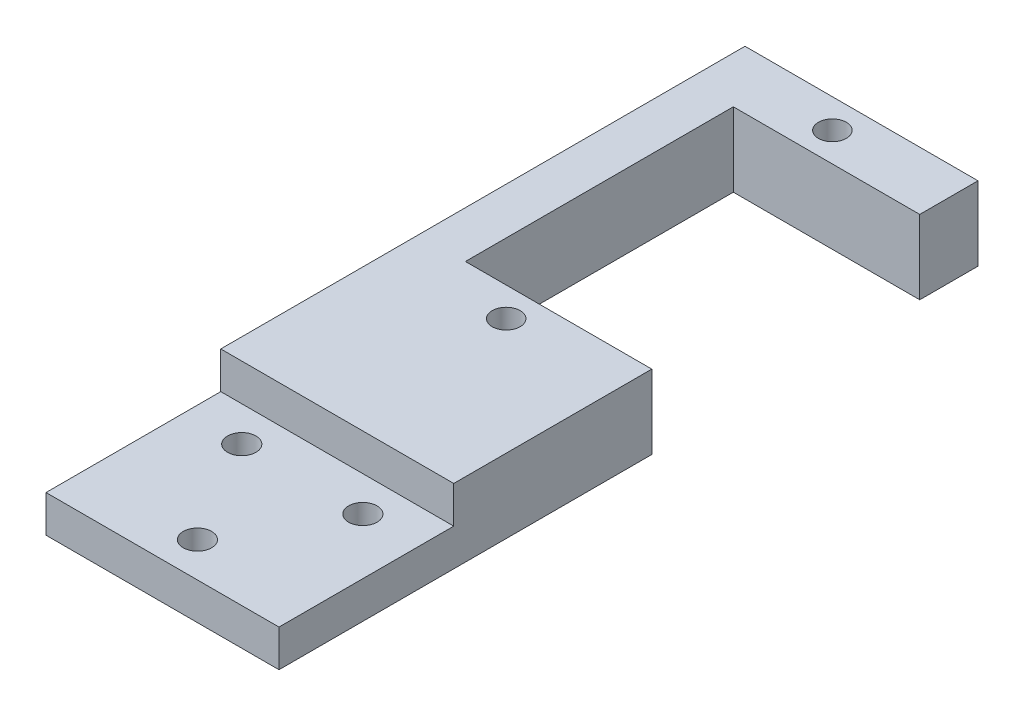
ISO-10303-21;
HEADER;
FILE_DESCRIPTION(('STEP AP214'),'2;1');
FILE_NAME('part.step','',(''),(''),'','','');
FILE_SCHEMA(('AUTOMOTIVE_DESIGN { 1 0 10303 214 1 1 1 1 }'));
ENDSEC;
DATA;
#1=APPLICATION_CONTEXT('core data for automotive mechanical design processes');
#2=APPLICATION_PROTOCOL_DEFINITION('international standard','automotive_design',2000,#1);
#3=PRODUCT_CONTEXT('',#1,'mechanical');
#4=PRODUCT('Part','Part','',(#3));
#5=PRODUCT_RELATED_PRODUCT_CATEGORY('part','',(#4));
#6=PRODUCT_DEFINITION_FORMATION('','',#4);
#7=PRODUCT_DEFINITION_CONTEXT('part definition',#1,'design');
#8=PRODUCT_DEFINITION('design','',#6,#7);
#9=PRODUCT_DEFINITION_SHAPE('','',#8);
#10=(LENGTH_UNIT() NAMED_UNIT(*) SI_UNIT(.MILLI.,.METRE.));
#11=(NAMED_UNIT(*) PLANE_ANGLE_UNIT() SI_UNIT($,.RADIAN.));
#12=(NAMED_UNIT(*) SI_UNIT($,.STERADIAN.) SOLID_ANGLE_UNIT());
#13=UNCERTAINTY_MEASURE_WITH_UNIT(LENGTH_MEASURE(1.E-05),#10,'distance_accuracy_value','');
#14=(GEOMETRIC_REPRESENTATION_CONTEXT(3) GLOBAL_UNCERTAINTY_ASSIGNED_CONTEXT((#13)) GLOBAL_UNIT_ASSIGNED_CONTEXT((#10,
#11,#12)) REPRESENTATION_CONTEXT('',''));
#15=CARTESIAN_POINT('',(0.,0.,0.));
#16=DIRECTION('',(0.,0.,1.));
#17=DIRECTION('',(1.,0.,0.));
#18=AXIS2_PLACEMENT_3D('',#15,#16,#17);
#19=CARTESIAN_POINT('',(0.,3.175,60.));
#20=DIRECTION('',(0.,-1.,0.));
#21=DIRECTION('',(0.,0.,-1.));
#22=AXIS2_PLACEMENT_3D('',#19,#20,#21);
#23=PLANE('',#22);
#24=CARTESIAN_POINT('',(4.80384757729338,3.175,48.));
#25=DIRECTION('',(0.,1.,0.));
#26=DIRECTION('',(0.,0.,1.));
#27=AXIS2_PLACEMENT_3D('',#24,#25,#26);
#28=CIRCLE('',#27,1.21919999999999);
#29=CARTESIAN_POINT('',(4.80384757729338,3.175,49.2192));
#30=VERTEX_POINT('',#29);
#31=EDGE_CURVE('E387',#30,#30,#28,.T.);
#32=ORIENTED_EDGE('',*,*,#31,.F.);
#33=EDGE_LOOP('',(#32));
#34=FACE_BOUND('',#33,.T.);
#35=CARTESIAN_POINT('',(10.,3.175,57.));
#36=DIRECTION('',(0.,1.,0.));
#37=DIRECTION('',(0.,0.,1.));
#38=AXIS2_PLACEMENT_3D('',#35,#36,#37);
#39=CIRCLE('',#38,1.21919999999999);
#40=CARTESIAN_POINT('',(10.,3.175,58.2192));
#41=VERTEX_POINT('',#40);
#42=EDGE_CURVE('E397',#41,#41,#39,.T.);
#43=ORIENTED_EDGE('',*,*,#42,.F.);
#44=EDGE_LOOP('',(#43));
#45=FACE_BOUND('',#44,.T.);
#46=DIRECTION('',(0.,0.,-1.));
#47=VECTOR('',#46,1.);
#48=CARTESIAN_POINT('',(20.,3.175,60.));
#49=LINE('',#48,#47);
#50=CARTESIAN_POINT('',(20.,3.175,60.));
#51=VERTEX_POINT('',#50);
#52=CARTESIAN_POINT('',(20.,3.175,45.));
#53=VERTEX_POINT('',#52);
#54=EDGE_CURVE('E163',#51,#53,#49,.T.);
#55=ORIENTED_EDGE('',*,*,#54,.T.);
#56=DIRECTION('',(1.,0.,0.));
#57=VECTOR('',#56,1.);
#58=CARTESIAN_POINT('',(0.,3.175,45.));
#59=LINE('',#58,#57);
#60=CARTESIAN_POINT('',(0.,3.175,45.));
#61=VERTEX_POINT('',#60);
#62=EDGE_CURVE('E117',#61,#53,#59,.T.);
#63=ORIENTED_EDGE('',*,*,#62,.F.);
#64=DIRECTION('',(0.,0.,-1.));
#65=VECTOR('',#64,1.);
#66=CARTESIAN_POINT('',(0.,3.175,60.));
#67=LINE('',#66,#65);
#68=CARTESIAN_POINT('',(0.,3.175,60.));
#69=VERTEX_POINT('',#68);
#70=EDGE_CURVE('E111',#69,#61,#67,.T.);
#71=ORIENTED_EDGE('',*,*,#70,.F.);
#72=DIRECTION('',(1.,0.,0.));
#73=VECTOR('',#72,1.);
#74=CARTESIAN_POINT('',(0.,3.175,60.));
#75=LINE('',#74,#73);
#76=EDGE_CURVE('E115',#69,#51,#75,.T.);
#77=ORIENTED_EDGE('',*,*,#76,.T.);
#78=EDGE_LOOP('',(#55,#63,#71,#77));
#79=FACE_BOUND('',#78,.T.);
#80=CARTESIAN_POINT('',(15.1961524227066,3.175,48.));
#81=DIRECTION('',(0.,1.,0.));
#82=DIRECTION('',(0.,0.,1.));
#83=AXIS2_PLACEMENT_3D('',#80,#81,#82);
#84=CIRCLE('',#83,1.21919999999999);
#85=CARTESIAN_POINT('',(15.1961524227066,3.175,49.2192));
#86=VERTEX_POINT('',#85);
#87=EDGE_CURVE('E389',#86,#86,#84,.T.);
#88=ORIENTED_EDGE('',*,*,#87,.F.);
#89=EDGE_LOOP('',(#88));
#90=FACE_BOUND('',#89,.T.);
#91=ADVANCED_FACE('F34',(#34,#45,#79,#90),#23,.F.);
#92=CARTESIAN_POINT('',(20.,6.35,0.));
#93=DIRECTION('',(-1.,0.,0.));
#94=DIRECTION('',(0.,0.,1.));
#95=AXIS2_PLACEMENT_3D('',#92,#93,#94);
#96=PLANE('',#95);
#97=DIRECTION('',(0.,0.,-1.));
#98=VECTOR('',#97,1.);
#99=CARTESIAN_POINT('',(20.,6.35,0.));
#100=LINE('',#99,#98);
#101=CARTESIAN_POINT('',(20.,6.35,5.));
#102=VERTEX_POINT('',#101);
#103=CARTESIAN_POINT('',(20.,6.35,0.));
#104=VERTEX_POINT('',#103);
#105=EDGE_CURVE('E191',#102,#104,#100,.T.);
#106=ORIENTED_EDGE('',*,*,#105,.F.);
#107=DIRECTION('',(0.,1.,0.));
#108=VECTOR('',#107,1.);
#109=CARTESIAN_POINT('',(20.,0.,5.));
#110=LINE('',#109,#108);
#111=CARTESIAN_POINT('',(20.,0.,5.));
#112=VERTEX_POINT('',#111);
#113=EDGE_CURVE('E144',#112,#102,#110,.T.);
#114=ORIENTED_EDGE('',*,*,#113,.F.);
#115=DIRECTION('',(0.,0.,-1.));
#116=VECTOR('',#115,1.);
#117=CARTESIAN_POINT('',(20.,0.,0.));
#118=LINE('',#117,#116);
#119=CARTESIAN_POINT('',(20.,0.,0.));
#120=VERTEX_POINT('',#119);
#121=EDGE_CURVE('E142',#112,#120,#118,.T.);
#122=ORIENTED_EDGE('',*,*,#121,.T.);
#123=DIRECTION('',(0.,-1.,0.));
#124=VECTOR('',#123,1.);
#125=CARTESIAN_POINT('',(20.,6.35,0.));
#126=LINE('',#125,#124);
#127=EDGE_CURVE('E157',#104,#120,#126,.T.);
#128=ORIENTED_EDGE('',*,*,#127,.F.);
#129=EDGE_LOOP('',(#106,#114,#122,#128));
#130=FACE_BOUND('',#129,.T.);
#131=ADVANCED_FACE('F204',(#130),#96,.F.);
#132=CARTESIAN_POINT('',(0.,6.35,0.));
#133=DIRECTION('',(1.,0.,0.));
#134=DIRECTION('',(0.,0.,-1.));
#135=AXIS2_PLACEMENT_3D('',#132,#133,#134);
#136=PLANE('',#135);
#137=ORIENTED_EDGE('',*,*,#70,.T.);
#138=DIRECTION('',(0.,1.,0.));
#139=VECTOR('',#138,1.);
#140=CARTESIAN_POINT('',(0.,6.35,45.));
#141=LINE('',#140,#139);
#142=CARTESIAN_POINT('',(0.,6.35,45.));
#143=VERTEX_POINT('',#142);
#144=EDGE_CURVE('E122',#61,#143,#141,.T.);
#145=ORIENTED_EDGE('',*,*,#144,.T.);
#146=DIRECTION('',(0.,0.,1.));
#147=VECTOR('',#146,1.);
#148=CARTESIAN_POINT('',(0.,6.35,0.));
#149=LINE('',#148,#147);
#150=CARTESIAN_POINT('',(0.,6.35,0.));
#151=VERTEX_POINT('',#150);
#152=EDGE_CURVE('E155',#151,#143,#149,.T.);
#153=ORIENTED_EDGE('',*,*,#152,.F.);
#154=DIRECTION('',(0.,-1.,0.));
#155=VECTOR('',#154,1.);
#156=CARTESIAN_POINT('',(0.,6.35,0.));
#157=LINE('',#156,#155);
#158=CARTESIAN_POINT('',(0.,0.,0.));
#159=VERTEX_POINT('',#158);
#160=EDGE_CURVE('E136',#151,#159,#157,.T.);
#161=ORIENTED_EDGE('',*,*,#160,.T.);
#162=DIRECTION('',(0.,0.,1.));
#163=VECTOR('',#162,1.);
#164=CARTESIAN_POINT('',(0.,0.,0.));
#165=LINE('',#164,#163);
#166=CARTESIAN_POINT('',(0.,0.,60.));
#167=VERTEX_POINT('',#166);
#168=EDGE_CURVE('E133',#159,#167,#165,.T.);
#169=ORIENTED_EDGE('',*,*,#168,.T.);
#170=DIRECTION('',(0.,-1.,0.));
#171=VECTOR('',#170,1.);
#172=CARTESIAN_POINT('',(0.,6.35,60.));
#173=LINE('',#172,#171);
#174=EDGE_CURVE('E11',#69,#167,#173,.T.);
#175=ORIENTED_EDGE('',*,*,#174,.F.);
#176=EDGE_LOOP('',(#137,#145,#153,#161,#169,#175));
#177=FACE_BOUND('',#176,.T.);
#178=ADVANCED_FACE('F36',(#177),#136,.F.);
#179=CARTESIAN_POINT('',(0.,6.35,60.));
#180=DIRECTION('',(0.,0.,-1.));
#181=DIRECTION('',(-1.,0.,0.));
#182=AXIS2_PLACEMENT_3D('',#179,#180,#181);
#183=PLANE('',#182);
#184=DIRECTION('',(0.,-1.,0.));
#185=VECTOR('',#184,1.);
#186=CARTESIAN_POINT('',(20.,6.35,60.));
#187=LINE('',#186,#185);
#188=CARTESIAN_POINT('',(20.,0.,60.));
#189=VERTEX_POINT('',#188);
#190=EDGE_CURVE('E42',#51,#189,#187,.T.);
#191=ORIENTED_EDGE('',*,*,#190,.F.);
#192=ORIENTED_EDGE('',*,*,#76,.F.);
#193=ORIENTED_EDGE('',*,*,#174,.T.);
#194=DIRECTION('',(1.,0.,0.));
#195=VECTOR('',#194,1.);
#196=CARTESIAN_POINT('',(0.,0.,60.));
#197=LINE('',#196,#195);
#198=EDGE_CURVE('E139',#167,#189,#197,.T.);
#199=ORIENTED_EDGE('',*,*,#198,.T.);
#200=EDGE_LOOP('',(#191,#192,#193,#199));
#201=FACE_BOUND('',#200,.T.);
#202=ADVANCED_FACE('F126',(#201),#183,.F.);
#203=CARTESIAN_POINT('',(20.,6.35,45.));
#204=VERTEX_POINT('',#203);
#205=CARTESIAN_POINT('',(20.,6.35,28.));
#206=VERTEX_POINT('',#205);
#207=EDGE_CURVE('E192',#204,#206,#100,.T.);
#208=ORIENTED_EDGE('',*,*,#207,.F.);
#209=DIRECTION('',(0.,1.,0.));
#210=VECTOR('',#209,1.);
#211=CARTESIAN_POINT('',(20.,6.35,45.));
#212=LINE('',#211,#210);
#213=EDGE_CURVE('E49',#53,#204,#212,.T.);
#214=ORIENTED_EDGE('',*,*,#213,.F.);
#215=ORIENTED_EDGE('',*,*,#54,.F.);
#216=ORIENTED_EDGE('',*,*,#190,.T.);
#217=CARTESIAN_POINT('',(20.,0.,28.));
#218=VERTEX_POINT('',#217);
#219=EDGE_CURVE('E150',#189,#218,#118,.T.);
#220=ORIENTED_EDGE('',*,*,#219,.T.);
#221=DIRECTION('',(0.,1.,0.));
#222=VECTOR('',#221,1.);
#223=CARTESIAN_POINT('',(20.,0.,28.));
#224=LINE('',#223,#222);
#225=EDGE_CURVE('E57',#218,#206,#224,.T.);
#226=ORIENTED_EDGE('',*,*,#225,.T.);
#227=EDGE_LOOP('',(#208,#214,#215,#216,#220,#226));
#228=FACE_BOUND('',#227,.T.);
#229=ADVANCED_FACE('F161',(#228),#96,.F.);
#230=CARTESIAN_POINT('',(0.,6.35,0.));
#231=DIRECTION('',(0.,0.,1.));
#232=DIRECTION('',(1.,0.,0.));
#233=AXIS2_PLACEMENT_3D('',#230,#231,#232);
#234=PLANE('',#233);
#235=DIRECTION('',(-1.,0.,0.));
#236=VECTOR('',#235,1.);
#237=CARTESIAN_POINT('',(0.,0.,0.));
#238=LINE('',#237,#236);
#239=EDGE_CURVE('E153',#120,#159,#238,.T.);
#240=ORIENTED_EDGE('',*,*,#239,.T.);
#241=ORIENTED_EDGE('',*,*,#160,.F.);
#242=DIRECTION('',(-1.,0.,0.));
#243=VECTOR('',#242,1.);
#244=CARTESIAN_POINT('',(0.,6.35,0.));
#245=LINE('',#244,#243);
#246=EDGE_CURVE('E147',#104,#151,#245,.T.);
#247=ORIENTED_EDGE('',*,*,#246,.F.);
#248=ORIENTED_EDGE('',*,*,#127,.T.);
#249=EDGE_LOOP('',(#240,#241,#247,#248));
#250=FACE_BOUND('',#249,.T.);
#251=ADVANCED_FACE('F206',(#250),#234,.F.);
#252=CARTESIAN_POINT('',(0.,6.35,0.));
#253=DIRECTION('',(0.,1.,0.));
#254=DIRECTION('',(0.,0.,1.));
#255=AXIS2_PLACEMENT_3D('',#252,#253,#254);
#256=PLANE('',#255);
#257=DIRECTION('',(1.,0.,0.));
#258=VECTOR('',#257,1.);
#259=CARTESIAN_POINT('',(0.,6.35,45.));
#260=LINE('',#259,#258);
#261=EDGE_CURVE('E207',#143,#204,#260,.T.);
#262=ORIENTED_EDGE('',*,*,#261,.T.);
#263=ORIENTED_EDGE('',*,*,#207,.T.);
#264=DIRECTION('',(1.,0.,0.));
#265=VECTOR('',#264,1.);
#266=CARTESIAN_POINT('',(4.,6.35,28.));
#267=LINE('',#266,#265);
#268=CARTESIAN_POINT('',(4.,6.35,28.));
#269=VERTEX_POINT('',#268);
#270=EDGE_CURVE('E182',#269,#206,#267,.T.);
#271=ORIENTED_EDGE('',*,*,#270,.F.);
#272=DIRECTION('',(0.,0.,1.));
#273=VECTOR('',#272,1.);
#274=CARTESIAN_POINT('',(4.,6.35,5.));
#275=LINE('',#274,#273);
#276=CARTESIAN_POINT('',(4.,6.35,5.));
#277=VERTEX_POINT('',#276);
#278=EDGE_CURVE('E179',#277,#269,#275,.T.);
#279=ORIENTED_EDGE('',*,*,#278,.F.);
#280=DIRECTION('',(-1.,0.,0.));
#281=VECTOR('',#280,1.);
#282=CARTESIAN_POINT('',(4.,6.35,5.));
#283=LINE('',#282,#281);
#284=EDGE_CURVE('E175',#102,#277,#283,.T.);
#285=ORIENTED_EDGE('',*,*,#284,.F.);
#286=ORIENTED_EDGE('',*,*,#105,.T.);
#287=ORIENTED_EDGE('',*,*,#246,.T.);
#288=ORIENTED_EDGE('',*,*,#152,.T.);
#289=EDGE_LOOP('',(#262,#263,#271,#279,#285,#286,#287,#288));
#290=FACE_BOUND('',#289,.T.);
#291=CARTESIAN_POINT('',(10.,6.35,2.5));
#292=DIRECTION('',(0.,1.,0.));
#293=DIRECTION('',(0.,0.,1.));
#294=AXIS2_PLACEMENT_3D('',#291,#292,#293);
#295=CIRCLE('',#294,1.19999999999999);
#296=CARTESIAN_POINT('',(10.,6.35,3.69999999999999));
#297=VERTEX_POINT('',#296);
#298=EDGE_CURVE('E208',#297,#297,#295,.T.);
#299=ORIENTED_EDGE('',*,*,#298,.F.);
#300=EDGE_LOOP('',(#299));
#301=FACE_BOUND('',#300,.T.);
#302=CARTESIAN_POINT('',(10.,6.35,30.5));
#303=DIRECTION('',(0.,1.,0.));
#304=DIRECTION('',(0.,0.,1.));
#305=AXIS2_PLACEMENT_3D('',#302,#303,#304);
#306=CIRCLE('',#305,1.19999999999999);
#307=CARTESIAN_POINT('',(10.,6.35,31.7));
#308=VERTEX_POINT('',#307);
#309=EDGE_CURVE('E221',#308,#308,#306,.T.);
#310=ORIENTED_EDGE('',*,*,#309,.F.);
#311=EDGE_LOOP('',(#310));
#312=FACE_BOUND('',#311,.T.);
#313=ADVANCED_FACE('F198',(#290,#301,#312),#256,.T.);
#314=CARTESIAN_POINT('',(0.,0.,0.));
#315=DIRECTION('',(0.,1.,0.));
#316=DIRECTION('',(0.,0.,1.));
#317=AXIS2_PLACEMENT_3D('',#314,#315,#316);
#318=PLANE('',#317);
#319=CARTESIAN_POINT('',(4.80384757729338,0.,48.));
#320=DIRECTION('',(0.,1.,0.));
#321=DIRECTION('',(0.,0.,1.));
#322=AXIS2_PLACEMENT_3D('',#319,#320,#321);
#323=CIRCLE('',#322,1.2192);
#324=CARTESIAN_POINT('',(4.80384757729338,0.,49.2192));
#325=VERTEX_POINT('',#324);
#326=EDGE_CURVE('E385',#325,#325,#323,.T.);
#327=ORIENTED_EDGE('',*,*,#326,.T.);
#328=EDGE_LOOP('',(#327));
#329=FACE_BOUND('',#328,.T.);
#330=CARTESIAN_POINT('',(15.1961524227066,0.,48.));
#331=DIRECTION('',(0.,1.,0.));
#332=DIRECTION('',(0.,0.,1.));
#333=AXIS2_PLACEMENT_3D('',#330,#331,#332);
#334=CIRCLE('',#333,1.2192);
#335=CARTESIAN_POINT('',(15.1961524227066,0.,49.2192));
#336=VERTEX_POINT('',#335);
#337=EDGE_CURVE('E394',#336,#336,#334,.T.);
#338=ORIENTED_EDGE('',*,*,#337,.T.);
#339=EDGE_LOOP('',(#338));
#340=FACE_BOUND('',#339,.T.);
#341=CARTESIAN_POINT('',(10.,0.,57.));
#342=DIRECTION('',(0.,1.,0.));
#343=DIRECTION('',(0.,0.,1.));
#344=AXIS2_PLACEMENT_3D('',#341,#342,#343);
#345=CIRCLE('',#344,1.2192);
#346=CARTESIAN_POINT('',(10.,0.,58.2192));
#347=VERTEX_POINT('',#346);
#348=EDGE_CURVE('E211',#347,#347,#345,.T.);
#349=ORIENTED_EDGE('',*,*,#348,.T.);
#350=EDGE_LOOP('',(#349));
#351=FACE_BOUND('',#350,.T.);
#352=CARTESIAN_POINT('',(10.,0.,2.5));
#353=DIRECTION('',(0.,1.,0.));
#354=DIRECTION('',(0.,0.,1.));
#355=AXIS2_PLACEMENT_3D('',#352,#353,#354);
#356=CIRCLE('',#355,1.2);
#357=CARTESIAN_POINT('',(10.,0.,3.7));
#358=VERTEX_POINT('',#357);
#359=EDGE_CURVE('E218',#358,#358,#356,.T.);
#360=ORIENTED_EDGE('',*,*,#359,.T.);
#361=EDGE_LOOP('',(#360));
#362=FACE_BOUND('',#361,.T.);
#363=CARTESIAN_POINT('',(10.,0.,30.5));
#364=DIRECTION('',(0.,1.,0.));
#365=DIRECTION('',(0.,0.,1.));
#366=AXIS2_PLACEMENT_3D('',#363,#364,#365);
#367=CIRCLE('',#366,1.2);
#368=CARTESIAN_POINT('',(10.,0.,31.7));
#369=VERTEX_POINT('',#368);
#370=EDGE_CURVE('E183',#369,#369,#367,.T.);
#371=ORIENTED_EDGE('',*,*,#370,.T.);
#372=EDGE_LOOP('',(#371));
#373=FACE_BOUND('',#372,.T.);
#374=ORIENTED_EDGE('',*,*,#121,.F.);
#375=DIRECTION('',(-1.,0.,0.));
#376=VECTOR('',#375,1.);
#377=CARTESIAN_POINT('',(4.,0.,5.));
#378=LINE('',#377,#376);
#379=CARTESIAN_POINT('',(4.,0.,5.));
#380=VERTEX_POINT('',#379);
#381=EDGE_CURVE('E171',#112,#380,#378,.T.);
#382=ORIENTED_EDGE('',*,*,#381,.T.);
#383=DIRECTION('',(0.,0.,1.));
#384=VECTOR('',#383,1.);
#385=CARTESIAN_POINT('',(4.,0.,5.));
#386=LINE('',#385,#384);
#387=CARTESIAN_POINT('',(4.,0.,28.));
#388=VERTEX_POINT('',#387);
#389=EDGE_CURVE('E170',#380,#388,#386,.T.);
#390=ORIENTED_EDGE('',*,*,#389,.T.);
#391=DIRECTION('',(1.,0.,0.));
#392=VECTOR('',#391,1.);
#393=CARTESIAN_POINT('',(4.,0.,28.));
#394=LINE('',#393,#392);
#395=EDGE_CURVE('E167',#388,#218,#394,.T.);
#396=ORIENTED_EDGE('',*,*,#395,.T.);
#397=ORIENTED_EDGE('',*,*,#219,.F.);
#398=ORIENTED_EDGE('',*,*,#198,.F.);
#399=ORIENTED_EDGE('',*,*,#168,.F.);
#400=ORIENTED_EDGE('',*,*,#239,.F.);
#401=EDGE_LOOP('',(#374,#382,#390,#396,#397,#398,#399,#400));
#402=FACE_BOUND('',#401,.T.);
#403=ADVANCED_FACE('F165',(#329,#340,#351,#362,#373,#402),#318,.F.);
#404=CARTESIAN_POINT('',(4.,0.,5.));
#405=DIRECTION('',(-1.,0.,0.));
#406=DIRECTION('',(0.,0.,1.));
#407=AXIS2_PLACEMENT_3D('',#404,#405,#406);
#408=PLANE('',#407);
#409=ORIENTED_EDGE('',*,*,#278,.T.);
#410=DIRECTION('',(0.,1.,0.));
#411=VECTOR('',#410,1.);
#412=CARTESIAN_POINT('',(4.,0.,28.));
#413=LINE('',#412,#411);
#414=EDGE_CURVE('E173',#388,#269,#413,.T.);
#415=ORIENTED_EDGE('',*,*,#414,.F.);
#416=ORIENTED_EDGE('',*,*,#389,.F.);
#417=DIRECTION('',(0.,1.,0.));
#418=VECTOR('',#417,1.);
#419=CARTESIAN_POINT('',(4.,0.,5.));
#420=LINE('',#419,#418);
#421=EDGE_CURVE('E140',#380,#277,#420,.T.);
#422=ORIENTED_EDGE('',*,*,#421,.T.);
#423=EDGE_LOOP('',(#409,#415,#416,#422));
#424=FACE_BOUND('',#423,.T.);
#425=ADVANCED_FACE('F241',(#424),#408,.F.);
#426=CARTESIAN_POINT('',(4.,0.,5.));
#427=DIRECTION('',(0.,0.,-1.));
#428=DIRECTION('',(-1.,0.,0.));
#429=AXIS2_PLACEMENT_3D('',#426,#427,#428);
#430=PLANE('',#429);
#431=ORIENTED_EDGE('',*,*,#284,.T.);
#432=ORIENTED_EDGE('',*,*,#421,.F.);
#433=ORIENTED_EDGE('',*,*,#381,.F.);
#434=ORIENTED_EDGE('',*,*,#113,.T.);
#435=EDGE_LOOP('',(#431,#432,#433,#434));
#436=FACE_BOUND('',#435,.T.);
#437=ADVANCED_FACE('F262',(#436),#430,.F.);
#438=CARTESIAN_POINT('',(4.,0.,28.));
#439=DIRECTION('',(0.,0.,1.));
#440=DIRECTION('',(1.,0.,0.));
#441=AXIS2_PLACEMENT_3D('',#438,#439,#440);
#442=PLANE('',#441);
#443=ORIENTED_EDGE('',*,*,#270,.T.);
#444=ORIENTED_EDGE('',*,*,#225,.F.);
#445=ORIENTED_EDGE('',*,*,#395,.F.);
#446=ORIENTED_EDGE('',*,*,#414,.T.);
#447=EDGE_LOOP('',(#443,#444,#445,#446));
#448=FACE_BOUND('',#447,.T.);
#449=ADVANCED_FACE('F231',(#448),#442,.F.);
#450=CARTESIAN_POINT('',(10.,6.35,30.5));
#451=DIRECTION('',(0.,1.,0.));
#452=DIRECTION('',(0.,0.,1.));
#453=AXIS2_PLACEMENT_3D('',#450,#451,#452);
#454=CYLINDRICAL_SURFACE('',#453,1.19999999999999);
#455=ORIENTED_EDGE('',*,*,#370,.F.);
#456=EDGE_LOOP('',(#455));
#457=FACE_BOUND('',#456,.T.);
#458=ORIENTED_EDGE('',*,*,#309,.T.);
#459=EDGE_LOOP('',(#458));
#460=FACE_BOUND('',#459,.T.);
#461=ADVANCED_FACE('F227',(#457,#460),#454,.F.);
#462=CARTESIAN_POINT('',(10.,6.35,2.5));
#463=DIRECTION('',(0.,1.,0.));
#464=DIRECTION('',(0.,0.,1.));
#465=AXIS2_PLACEMENT_3D('',#462,#463,#464);
#466=CYLINDRICAL_SURFACE('',#465,1.19999999999999);
#467=ORIENTED_EDGE('',*,*,#359,.F.);
#468=EDGE_LOOP('',(#467));
#469=FACE_BOUND('',#468,.T.);
#470=ORIENTED_EDGE('',*,*,#298,.T.);
#471=EDGE_LOOP('',(#470));
#472=FACE_BOUND('',#471,.T.);
#473=ADVANCED_FACE('F230',(#469,#472),#466,.F.);
#474=CARTESIAN_POINT('',(0.,6.35,45.));
#475=DIRECTION('',(0.,0.,-1.));
#476=DIRECTION('',(-1.,0.,0.));
#477=AXIS2_PLACEMENT_3D('',#474,#475,#476);
#478=PLANE('',#477);
#479=ORIENTED_EDGE('',*,*,#213,.T.);
#480=ORIENTED_EDGE('',*,*,#261,.F.);
#481=ORIENTED_EDGE('',*,*,#144,.F.);
#482=ORIENTED_EDGE('',*,*,#62,.T.);
#483=EDGE_LOOP('',(#479,#480,#481,#482));
#484=FACE_BOUND('',#483,.T.);
#485=ADVANCED_FACE('F257',(#484),#478,.F.);
#486=CARTESIAN_POINT('',(10.,3.175,57.));
#487=DIRECTION('',(0.,1.,0.));
#488=DIRECTION('',(0.,0.,1.));
#489=AXIS2_PLACEMENT_3D('',#486,#487,#488);
#490=CYLINDRICAL_SURFACE('',#489,1.21919999999999);
#491=ORIENTED_EDGE('',*,*,#348,.F.);
#492=EDGE_LOOP('',(#491));
#493=FACE_BOUND('',#492,.T.);
#494=ORIENTED_EDGE('',*,*,#42,.T.);
#495=EDGE_LOOP('',(#494));
#496=FACE_BOUND('',#495,.T.);
#497=ADVANCED_FACE('F297',(#493,#496),#490,.F.);
#498=CARTESIAN_POINT('',(15.1961524227066,3.175,48.));
#499=DIRECTION('',(0.,1.,0.));
#500=DIRECTION('',(0.,0.,1.));
#501=AXIS2_PLACEMENT_3D('',#498,#499,#500);
#502=CYLINDRICAL_SURFACE('',#501,1.21919999999999);
#503=ORIENTED_EDGE('',*,*,#337,.F.);
#504=EDGE_LOOP('',(#503));
#505=FACE_BOUND('',#504,.T.);
#506=ORIENTED_EDGE('',*,*,#87,.T.);
#507=EDGE_LOOP('',(#506));
#508=FACE_BOUND('',#507,.T.);
#509=ADVANCED_FACE('F303',(#505,#508),#502,.F.);
#510=CARTESIAN_POINT('',(4.80384757729338,3.175,48.));
#511=DIRECTION('',(0.,1.,0.));
#512=DIRECTION('',(0.,0.,1.));
#513=AXIS2_PLACEMENT_3D('',#510,#511,#512);
#514=CYLINDRICAL_SURFACE('',#513,1.21919999999999);
#515=ORIENTED_EDGE('',*,*,#326,.F.);
#516=EDGE_LOOP('',(#515));
#517=FACE_BOUND('',#516,.T.);
#518=ORIENTED_EDGE('',*,*,#31,.T.);
#519=EDGE_LOOP('',(#518));
#520=FACE_BOUND('',#519,.T.);
#521=ADVANCED_FACE('F310',(#517,#520),#514,.F.);
#522=CLOSED_SHELL('',(#91,#131,#178,#202,#229,#251,#313,#403,#425,#437,#449,#461,#473,#485,#497,
#509,#521));
#523=MANIFOLD_SOLID_BREP('B2',#522);
#524=ADVANCED_BREP_SHAPE_REPRESENTATION('',(#18,#523),#14);
#525=SHAPE_DEFINITION_REPRESENTATION(#9,#524);
ENDSEC;
END-ISO-10303-21;
